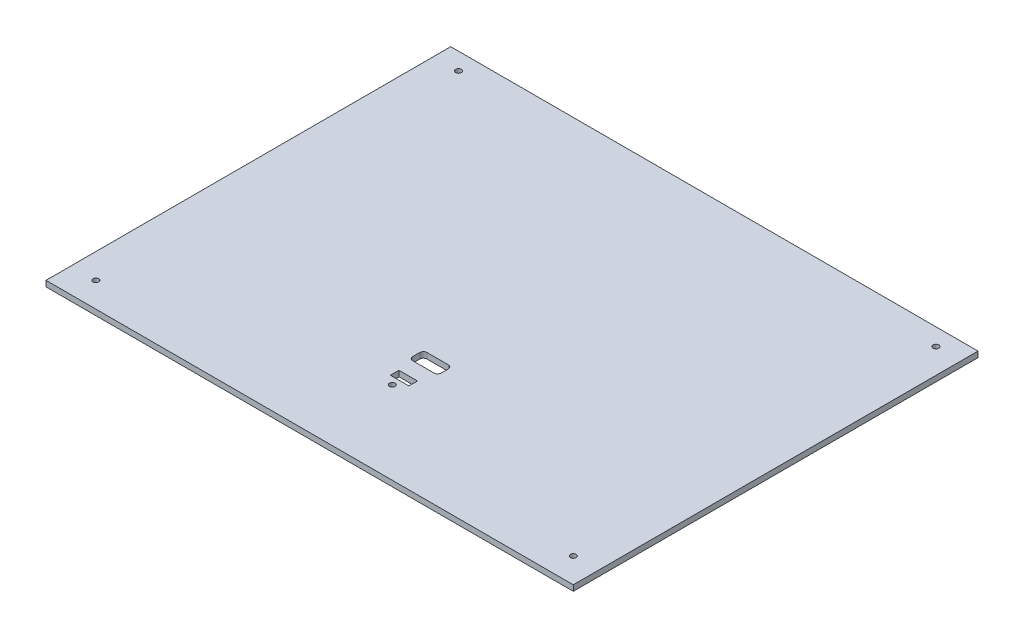
ISO-10303-21;
HEADER;
FILE_DESCRIPTION(('STEP AP214'),'2;1');
FILE_NAME('part.step','',(''),(''),'','','');
FILE_SCHEMA(('AUTOMOTIVE_DESIGN { 1 0 10303 214 1 1 1 1 }'));
ENDSEC;
DATA;
#1=APPLICATION_CONTEXT('core data for automotive mechanical design processes');
#2=APPLICATION_PROTOCOL_DEFINITION('international standard','automotive_design',2000,#1);
#3=PRODUCT_CONTEXT('',#1,'mechanical');
#4=PRODUCT('Part','Part','',(#3));
#5=PRODUCT_RELATED_PRODUCT_CATEGORY('part','',(#4));
#6=PRODUCT_DEFINITION_FORMATION('','',#4);
#7=PRODUCT_DEFINITION_CONTEXT('part definition',#1,'design');
#8=PRODUCT_DEFINITION('design','',#6,#7);
#9=PRODUCT_DEFINITION_SHAPE('','',#8);
#10=(LENGTH_UNIT() NAMED_UNIT(*) SI_UNIT(.MILLI.,.METRE.));
#11=(NAMED_UNIT(*) PLANE_ANGLE_UNIT() SI_UNIT($,.RADIAN.));
#12=(NAMED_UNIT(*) SI_UNIT($,.STERADIAN.) SOLID_ANGLE_UNIT());
#13=UNCERTAINTY_MEASURE_WITH_UNIT(LENGTH_MEASURE(1.E-05),#10,'distance_accuracy_value','');
#14=(GEOMETRIC_REPRESENTATION_CONTEXT(3) GLOBAL_UNCERTAINTY_ASSIGNED_CONTEXT((#13)) GLOBAL_UNIT_ASSIGNED_CONTEXT((#10,
#11,#12)) REPRESENTATION_CONTEXT('',''));
#15=CARTESIAN_POINT('',(0.,0.,0.));
#16=DIRECTION('',(0.,0.,1.));
#17=DIRECTION('',(1.,0.,0.));
#18=AXIS2_PLACEMENT_3D('',#15,#16,#17);
#19=CARTESIAN_POINT('',(-185.,4.,142.));
#20=DIRECTION('',(1.,0.,0.));
#21=DIRECTION('',(0.,0.,-1.));
#22=AXIS2_PLACEMENT_3D('',#19,#20,#21);
#23=PLANE('',#22);
#24=DIRECTION('',(0.,0.,1.));
#25=VECTOR('',#24,1.);
#26=CARTESIAN_POINT('',(-185.,0.,142.));
#27=LINE('',#26,#25);
#28=CARTESIAN_POINT('',(-185.,0.,-142.));
#29=VERTEX_POINT('',#28);
#30=CARTESIAN_POINT('',(-185.,0.,142.));
#31=VERTEX_POINT('',#30);
#32=EDGE_CURVE('E263',#29,#31,#27,.T.);
#33=ORIENTED_EDGE('',*,*,#32,.T.);
#34=DIRECTION('',(0.,-1.,0.));
#35=VECTOR('',#34,1.);
#36=CARTESIAN_POINT('',(-185.,4.,142.));
#37=LINE('',#36,#35);
#38=CARTESIAN_POINT('',(-185.,4.,142.));
#39=VERTEX_POINT('',#38);
#40=EDGE_CURVE('E301',#39,#31,#37,.T.);
#41=ORIENTED_EDGE('',*,*,#40,.F.);
#42=DIRECTION('',(0.,0.,1.));
#43=VECTOR('',#42,1.);
#44=CARTESIAN_POINT('',(-185.,4.,142.));
#45=LINE('',#44,#43);
#46=CARTESIAN_POINT('',(-185.,4.,-142.));
#47=VERTEX_POINT('',#46);
#48=EDGE_CURVE('E264',#47,#39,#45,.T.);
#49=ORIENTED_EDGE('',*,*,#48,.F.);
#50=DIRECTION('',(0.,-1.,0.));
#51=VECTOR('',#50,1.);
#52=CARTESIAN_POINT('',(-185.,4.,-142.));
#53=LINE('',#52,#51);
#54=EDGE_CURVE('E278',#47,#29,#53,.T.);
#55=ORIENTED_EDGE('',*,*,#54,.T.);
#56=EDGE_LOOP('',(#33,#41,#49,#55));
#57=FACE_BOUND('',#56,.T.);
#58=ADVANCED_FACE('F43',(#57),#23,.F.);
#59=CARTESIAN_POINT('',(185.,4.,142.));
#60=DIRECTION('',(0.,0.,-1.));
#61=DIRECTION('',(-1.,0.,0.));
#62=AXIS2_PLACEMENT_3D('',#59,#60,#61);
#63=PLANE('',#62);
#64=DIRECTION('',(1.,0.,0.));
#65=VECTOR('',#64,1.);
#66=CARTESIAN_POINT('',(185.,0.,142.));
#67=LINE('',#66,#65);
#68=CARTESIAN_POINT('',(185.,0.,142.));
#69=VERTEX_POINT('',#68);
#70=EDGE_CURVE('E282',#31,#69,#67,.T.);
#71=ORIENTED_EDGE('',*,*,#70,.T.);
#72=DIRECTION('',(0.,-1.,0.));
#73=VECTOR('',#72,1.);
#74=CARTESIAN_POINT('',(185.,4.,142.));
#75=LINE('',#74,#73);
#76=CARTESIAN_POINT('',(185.,4.,142.));
#77=VERTEX_POINT('',#76);
#78=EDGE_CURVE('E297',#77,#69,#75,.T.);
#79=ORIENTED_EDGE('',*,*,#78,.F.);
#80=DIRECTION('',(1.,0.,0.));
#81=VECTOR('',#80,1.);
#82=CARTESIAN_POINT('',(185.,4.,142.));
#83=LINE('',#82,#81);
#84=EDGE_CURVE('E268',#39,#77,#83,.T.);
#85=ORIENTED_EDGE('',*,*,#84,.F.);
#86=ORIENTED_EDGE('',*,*,#40,.T.);
#87=EDGE_LOOP('',(#71,#79,#85,#86));
#88=FACE_BOUND('',#87,.T.);
#89=ADVANCED_FACE('F395',(#88),#63,.F.);
#90=CARTESIAN_POINT('',(185.,4.,142.));
#91=DIRECTION('',(-1.,0.,0.));
#92=DIRECTION('',(0.,0.,1.));
#93=AXIS2_PLACEMENT_3D('',#90,#91,#92);
#94=PLANE('',#93);
#95=DIRECTION('',(0.,0.,-1.));
#96=VECTOR('',#95,1.);
#97=CARTESIAN_POINT('',(185.,0.,142.));
#98=LINE('',#97,#96);
#99=CARTESIAN_POINT('',(185.,0.,-142.));
#100=VERTEX_POINT('',#99);
#101=EDGE_CURVE('E285',#69,#100,#98,.T.);
#102=ORIENTED_EDGE('',*,*,#101,.T.);
#103=DIRECTION('',(0.,-1.,0.));
#104=VECTOR('',#103,1.);
#105=CARTESIAN_POINT('',(185.,4.,-142.));
#106=LINE('',#105,#104);
#107=CARTESIAN_POINT('',(185.,4.,-142.));
#108=VERTEX_POINT('',#107);
#109=EDGE_CURVE('E293',#108,#100,#106,.T.);
#110=ORIENTED_EDGE('',*,*,#109,.F.);
#111=DIRECTION('',(0.,0.,-1.));
#112=VECTOR('',#111,1.);
#113=CARTESIAN_POINT('',(185.,4.,142.));
#114=LINE('',#113,#112);
#115=EDGE_CURVE('E272',#77,#108,#114,.T.);
#116=ORIENTED_EDGE('',*,*,#115,.F.);
#117=ORIENTED_EDGE('',*,*,#78,.T.);
#118=EDGE_LOOP('',(#102,#110,#116,#117));
#119=FACE_BOUND('',#118,.T.);
#120=ADVANCED_FACE('F400',(#119),#94,.F.);
#121=CARTESIAN_POINT('',(185.,4.,-142.));
#122=DIRECTION('',(0.,0.,1.));
#123=DIRECTION('',(1.,0.,0.));
#124=AXIS2_PLACEMENT_3D('',#121,#122,#123);
#125=PLANE('',#124);
#126=DIRECTION('',(-1.,0.,0.));
#127=VECTOR('',#126,1.);
#128=CARTESIAN_POINT('',(185.,0.,-142.));
#129=LINE('',#128,#127);
#130=EDGE_CURVE('E269',#100,#29,#129,.T.);
#131=ORIENTED_EDGE('',*,*,#130,.T.);
#132=ORIENTED_EDGE('',*,*,#54,.F.);
#133=DIRECTION('',(-1.,0.,0.));
#134=VECTOR('',#133,1.);
#135=CARTESIAN_POINT('',(185.,4.,-142.));
#136=LINE('',#135,#134);
#137=EDGE_CURVE('E275',#108,#47,#136,.T.);
#138=ORIENTED_EDGE('',*,*,#137,.F.);
#139=ORIENTED_EDGE('',*,*,#109,.T.);
#140=EDGE_LOOP('',(#131,#132,#138,#139));
#141=FACE_BOUND('',#140,.T.);
#142=ADVANCED_FACE('F406',(#141),#125,.F.);
#143=CARTESIAN_POINT('',(0.,4.,0.));
#144=DIRECTION('',(0.,1.,0.));
#145=DIRECTION('',(0.,0.,1.));
#146=AXIS2_PLACEMENT_3D('',#143,#144,#145);
#147=PLANE('',#146);
#148=CARTESIAN_POINT('',(-167.5,4.,124.5));
#149=DIRECTION('',(0.,1.,0.));
#150=DIRECTION('',(0.,0.,-1.));
#151=AXIS2_PLACEMENT_3D('',#148,#149,#150);
#152=CIRCLE('',#151,2.);
#153=CARTESIAN_POINT('',(-167.5,4.,122.5));
#154=VERTEX_POINT('',#153);
#155=EDGE_CURVE('E226',#154,#154,#152,.T.);
#156=ORIENTED_EDGE('',*,*,#155,.F.);
#157=EDGE_LOOP('',(#156));
#158=FACE_BOUND('',#157,.T.);
#159=CARTESIAN_POINT('',(167.5,4.,124.5));
#160=DIRECTION('',(0.,1.,0.));
#161=DIRECTION('',(0.,0.,1.));
#162=AXIS2_PLACEMENT_3D('',#159,#160,#161);
#163=CIRCLE('',#162,2.);
#164=CARTESIAN_POINT('',(167.5,4.,126.5));
#165=VERTEX_POINT('',#164);
#166=EDGE_CURVE('E227',#165,#165,#163,.T.);
#167=ORIENTED_EDGE('',*,*,#166,.F.);
#168=EDGE_LOOP('',(#167));
#169=FACE_BOUND('',#168,.T.);
#170=CARTESIAN_POINT('',(167.5,4.,-130.));
#171=DIRECTION('',(0.,1.,0.));
#172=DIRECTION('',(0.,0.,-1.));
#173=AXIS2_PLACEMENT_3D('',#170,#171,#172);
#174=CIRCLE('',#173,2.);
#175=CARTESIAN_POINT('',(167.5,4.,-132.));
#176=VERTEX_POINT('',#175);
#177=EDGE_CURVE('E236',#176,#176,#174,.T.);
#178=ORIENTED_EDGE('',*,*,#177,.F.);
#179=EDGE_LOOP('',(#178));
#180=FACE_BOUND('',#179,.T.);
#181=CARTESIAN_POINT('',(0.,4.,84.));
#182=DIRECTION('',(0.,1.,0.));
#183=DIRECTION('',(0.,0.,1.));
#184=AXIS2_PLACEMENT_3D('',#181,#182,#183);
#185=CIRCLE('',#184,2.);
#186=CARTESIAN_POINT('',(0.,4.,86.));
#187=VERTEX_POINT('',#186);
#188=EDGE_CURVE('E244',#187,#187,#185,.T.);
#189=ORIENTED_EDGE('',*,*,#188,.F.);
#190=EDGE_LOOP('',(#189));
#191=FACE_BOUND('',#190,.T.);
#192=DIRECTION('',(0.,0.,1.));
#193=VECTOR('',#192,1.);
#194=CARTESIAN_POINT('',(-6.50000000000001,4.,72.85));
#195=LINE('',#194,#193);
#196=CARTESIAN_POINT('',(-6.50000000000001,4.,72.85));
#197=VERTEX_POINT('',#196);
#198=CARTESIAN_POINT('',(-6.50000000000001,4.,78.85));
#199=VERTEX_POINT('',#198);
#200=EDGE_CURVE('E252',#197,#199,#195,.T.);
#201=ORIENTED_EDGE('',*,*,#200,.F.);
#202=DIRECTION('',(-1.,0.,0.));
#203=VECTOR('',#202,1.);
#204=CARTESIAN_POINT('',(6.49999999999999,4.,72.85));
#205=LINE('',#204,#203);
#206=CARTESIAN_POINT('',(6.49999999999999,4.,72.85));
#207=VERTEX_POINT('',#206);
#208=EDGE_CURVE('E175',#207,#197,#205,.T.);
#209=ORIENTED_EDGE('',*,*,#208,.F.);
#210=DIRECTION('',(0.,0.,-1.));
#211=VECTOR('',#210,1.);
#212=CARTESIAN_POINT('',(6.49999999999999,4.,72.85));
#213=LINE('',#212,#211);
#214=CARTESIAN_POINT('',(6.49999999999999,4.,78.85));
#215=VERTEX_POINT('',#214);
#216=EDGE_CURVE('E647',#215,#207,#213,.T.);
#217=ORIENTED_EDGE('',*,*,#216,.F.);
#218=DIRECTION('',(1.,0.,0.));
#219=VECTOR('',#218,1.);
#220=CARTESIAN_POINT('',(6.49999999999999,4.,78.85));
#221=LINE('',#220,#219);
#222=EDGE_CURVE('E651',#199,#215,#221,.T.);
#223=ORIENTED_EDGE('',*,*,#222,.F.);
#224=EDGE_LOOP('',(#201,#209,#217,#223));
#225=FACE_BOUND('',#224,.T.);
#226=DIRECTION('',(0.,0.,1.));
#227=VECTOR('',#226,1.);
#228=CARTESIAN_POINT('',(-10.,4.,52.1873810908358));
#229=LINE('',#228,#227);
#230=CARTESIAN_POINT('',(-10.,4.,54.6873810908358));
#231=VERTEX_POINT('',#230);
#232=CARTESIAN_POINT('',(-10.,4.,59.6873810908358));
#233=VERTEX_POINT('',#232);
#234=EDGE_CURVE('E209',#231,#233,#229,.T.);
#235=ORIENTED_EDGE('',*,*,#234,.F.);
#236=CARTESIAN_POINT('',(-7.5,4.,54.6873810908358));
#237=DIRECTION('',(0.,1.,0.));
#238=DIRECTION('',(0.,0.,1.));
#239=AXIS2_PLACEMENT_3D('',#236,#237,#238);
#240=CIRCLE('',#239,2.5);
#241=CARTESIAN_POINT('',(-7.5,4.,52.1873810908358));
#242=VERTEX_POINT('',#241);
#243=EDGE_CURVE('E52',#231,#242,#240,.F.);
#244=ORIENTED_EDGE('',*,*,#243,.T.);
#245=DIRECTION('',(-1.,0.,0.));
#246=VECTOR('',#245,1.);
#247=CARTESIAN_POINT('',(10.,4.,52.1873810908358));
#248=LINE('',#247,#246);
#249=CARTESIAN_POINT('',(7.5,4.,52.1873810908358));
#250=VERTEX_POINT('',#249);
#251=EDGE_CURVE('E196',#250,#242,#248,.T.);
#252=ORIENTED_EDGE('',*,*,#251,.F.);
#253=CARTESIAN_POINT('',(7.5,4.,54.6873810908358));
#254=DIRECTION('',(0.,1.,0.));
#255=DIRECTION('',(0.,0.,1.));
#256=AXIS2_PLACEMENT_3D('',#253,#254,#255);
#257=CIRCLE('',#256,2.5);
#258=CARTESIAN_POINT('',(10.,4.,54.6873810908358));
#259=VERTEX_POINT('',#258);
#260=EDGE_CURVE('E332',#250,#259,#257,.F.);
#261=ORIENTED_EDGE('',*,*,#260,.T.);
#262=DIRECTION('',(0.,0.,-1.));
#263=VECTOR('',#262,1.);
#264=CARTESIAN_POINT('',(10.,4.,52.1873810908358));
#265=LINE('',#264,#263);
#266=CARTESIAN_POINT('',(10.,4.,59.6873810908358));
#267=VERTEX_POINT('',#266);
#268=EDGE_CURVE('E200',#267,#259,#265,.T.);
#269=ORIENTED_EDGE('',*,*,#268,.F.);
#270=CARTESIAN_POINT('',(7.5,4.,59.6873810908358));
#271=DIRECTION('',(0.,1.,0.));
#272=DIRECTION('',(0.,0.,1.));
#273=AXIS2_PLACEMENT_3D('',#270,#271,#272);
#274=CIRCLE('',#273,2.5);
#275=CARTESIAN_POINT('',(7.5,4.,62.1873810908358));
#276=VERTEX_POINT('',#275);
#277=EDGE_CURVE('E338',#267,#276,#274,.F.);
#278=ORIENTED_EDGE('',*,*,#277,.T.);
#279=DIRECTION('',(1.,0.,0.));
#280=VECTOR('',#279,1.);
#281=CARTESIAN_POINT('',(10.,4.,62.1873810908358));
#282=LINE('',#281,#280);
#283=CARTESIAN_POINT('',(-7.5,4.,62.1873810908358));
#284=VERTEX_POINT('',#283);
#285=EDGE_CURVE('E205',#284,#276,#282,.T.);
#286=ORIENTED_EDGE('',*,*,#285,.F.);
#287=CARTESIAN_POINT('',(-7.5,4.,59.6873810908358));
#288=DIRECTION('',(0.,1.,0.));
#289=DIRECTION('',(0.,0.,1.));
#290=AXIS2_PLACEMENT_3D('',#287,#288,#289);
#291=CIRCLE('',#290,2.5);
#292=EDGE_CURVE('E59',#284,#233,#291,.F.);
#293=ORIENTED_EDGE('',*,*,#292,.T.);
#294=EDGE_LOOP('',(#235,#244,#252,#261,#269,#278,#286,#293));
#295=FACE_BOUND('',#294,.T.);
#296=CARTESIAN_POINT('',(-167.5,4.,-130.));
#297=DIRECTION('',(0.,1.,0.));
#298=DIRECTION('',(0.,0.,1.));
#299=AXIS2_PLACEMENT_3D('',#296,#297,#298);
#300=CIRCLE('',#299,2.);
#301=CARTESIAN_POINT('',(-167.5,4.,-128.));
#302=VERTEX_POINT('',#301);
#303=EDGE_CURVE('E231',#302,#302,#300,.T.);
#304=ORIENTED_EDGE('',*,*,#303,.F.);
#305=EDGE_LOOP('',(#304));
#306=FACE_BOUND('',#305,.T.);
#307=ORIENTED_EDGE('',*,*,#48,.T.);
#308=ORIENTED_EDGE('',*,*,#84,.T.);
#309=ORIENTED_EDGE('',*,*,#115,.T.);
#310=ORIENTED_EDGE('',*,*,#137,.T.);
#311=EDGE_LOOP('',(#307,#308,#309,#310));
#312=FACE_BOUND('',#311,.T.);
#313=ADVANCED_FACE('F350',(#158,#169,#180,#191,#225,#295,#306,#312),#147,.T.);
#314=CARTESIAN_POINT('',(0.,0.,0.));
#315=DIRECTION('',(0.,1.,0.));
#316=DIRECTION('',(0.,0.,1.));
#317=AXIS2_PLACEMENT_3D('',#314,#315,#316);
#318=PLANE('',#317);
#319=CARTESIAN_POINT('',(-167.5,0.,124.5));
#320=DIRECTION('',(0.,1.,0.));
#321=DIRECTION('',(0.,0.,1.));
#322=AXIS2_PLACEMENT_3D('',#319,#320,#321);
#323=CIRCLE('',#322,2.);
#324=CARTESIAN_POINT('',(-167.5,0.,126.5));
#325=VERTEX_POINT('',#324);
#326=EDGE_CURVE('E222',#325,#325,#323,.F.);
#327=ORIENTED_EDGE('',*,*,#326,.F.);
#328=EDGE_LOOP('',(#327));
#329=FACE_BOUND('',#328,.T.);
#330=CARTESIAN_POINT('',(167.5,0.,124.5));
#331=DIRECTION('',(0.,1.,0.));
#332=DIRECTION('',(0.,0.,1.));
#333=AXIS2_PLACEMENT_3D('',#330,#331,#332);
#334=CIRCLE('',#333,2.);
#335=CARTESIAN_POINT('',(167.5,0.,126.5));
#336=VERTEX_POINT('',#335);
#337=EDGE_CURVE('E232',#336,#336,#334,.F.);
#338=ORIENTED_EDGE('',*,*,#337,.F.);
#339=EDGE_LOOP('',(#338));
#340=FACE_BOUND('',#339,.T.);
#341=CARTESIAN_POINT('',(167.5,0.,-130.));
#342=DIRECTION('',(0.,1.,0.));
#343=DIRECTION('',(0.,0.,1.));
#344=AXIS2_PLACEMENT_3D('',#341,#342,#343);
#345=CIRCLE('',#344,2.);
#346=CARTESIAN_POINT('',(167.5,0.,-128.));
#347=VERTEX_POINT('',#346);
#348=EDGE_CURVE('E240',#347,#347,#345,.F.);
#349=ORIENTED_EDGE('',*,*,#348,.F.);
#350=EDGE_LOOP('',(#349));
#351=FACE_BOUND('',#350,.T.);
#352=CARTESIAN_POINT('',(0.,0.,84.));
#353=DIRECTION('',(0.,1.,0.));
#354=DIRECTION('',(0.,0.,1.));
#355=AXIS2_PLACEMENT_3D('',#352,#353,#354);
#356=CIRCLE('',#355,2.);
#357=CARTESIAN_POINT('',(0.,0.,86.));
#358=VERTEX_POINT('',#357);
#359=EDGE_CURVE('E248',#358,#358,#356,.F.);
#360=ORIENTED_EDGE('',*,*,#359,.F.);
#361=EDGE_LOOP('',(#360));
#362=FACE_BOUND('',#361,.T.);
#363=DIRECTION('',(1.,0.,0.));
#364=VECTOR('',#363,1.);
#365=CARTESIAN_POINT('',(6.49999999999999,0.,72.85));
#366=LINE('',#365,#364);
#367=CARTESIAN_POINT('',(-6.50000000000001,0.,72.85));
#368=VERTEX_POINT('',#367);
#369=CARTESIAN_POINT('',(6.49999999999999,0.,72.85));
#370=VERTEX_POINT('',#369);
#371=EDGE_CURVE('E168',#368,#370,#366,.T.);
#372=ORIENTED_EDGE('',*,*,#371,.F.);
#373=DIRECTION('',(0.,0.,-1.));
#374=VECTOR('',#373,1.);
#375=CARTESIAN_POINT('',(-6.50000000000001,0.,72.85));
#376=LINE('',#375,#374);
#377=CARTESIAN_POINT('',(-6.50000000000001,0.,78.85));
#378=VERTEX_POINT('',#377);
#379=EDGE_CURVE('E157',#378,#368,#376,.T.);
#380=ORIENTED_EDGE('',*,*,#379,.F.);
#381=DIRECTION('',(-1.,0.,0.));
#382=VECTOR('',#381,1.);
#383=CARTESIAN_POINT('',(6.49999999999999,0.,78.85));
#384=LINE('',#383,#382);
#385=CARTESIAN_POINT('',(6.49999999999999,0.,78.85));
#386=VERTEX_POINT('',#385);
#387=EDGE_CURVE('E169',#386,#378,#384,.T.);
#388=ORIENTED_EDGE('',*,*,#387,.F.);
#389=DIRECTION('',(0.,0.,1.));
#390=VECTOR('',#389,1.);
#391=CARTESIAN_POINT('',(6.49999999999999,0.,72.85));
#392=LINE('',#391,#390);
#393=EDGE_CURVE('E179',#370,#386,#392,.T.);
#394=ORIENTED_EDGE('',*,*,#393,.F.);
#395=EDGE_LOOP('',(#372,#380,#388,#394));
#396=FACE_BOUND('',#395,.T.);
#397=DIRECTION('',(1.,0.,0.));
#398=VECTOR('',#397,1.);
#399=CARTESIAN_POINT('',(10.,0.,52.1873810908358));
#400=LINE('',#399,#398);
#401=CARTESIAN_POINT('',(-7.5,0.,52.1873810908358));
#402=VERTEX_POINT('',#401);
#403=CARTESIAN_POINT('',(7.5,0.,52.1873810908358));
#404=VERTEX_POINT('',#403);
#405=EDGE_CURVE('E215',#402,#404,#400,.T.);
#406=ORIENTED_EDGE('',*,*,#405,.F.);
#407=CARTESIAN_POINT('',(-7.5,0.,54.6873810908358));
#408=DIRECTION('',(0.,1.,0.));
#409=DIRECTION('',(0.,0.,1.));
#410=AXIS2_PLACEMENT_3D('',#407,#408,#409);
#411=CIRCLE('',#410,2.5);
#412=CARTESIAN_POINT('',(-10.,0.,54.6873810908358));
#413=VERTEX_POINT('',#412);
#414=EDGE_CURVE('E11',#402,#413,#411,.T.);
#415=ORIENTED_EDGE('',*,*,#414,.T.);
#416=DIRECTION('',(0.,0.,-1.));
#417=VECTOR('',#416,1.);
#418=CARTESIAN_POINT('',(-10.,0.,52.1873810908358));
#419=LINE('',#418,#417);
#420=CARTESIAN_POINT('',(-10.,0.,59.6873810908358));
#421=VERTEX_POINT('',#420);
#422=EDGE_CURVE('E195',#421,#413,#419,.T.);
#423=ORIENTED_EDGE('',*,*,#422,.F.);
#424=CARTESIAN_POINT('',(-7.5,0.,59.6873810908358));
#425=DIRECTION('',(0.,1.,0.));
#426=DIRECTION('',(0.,0.,1.));
#427=AXIS2_PLACEMENT_3D('',#424,#425,#426);
#428=CIRCLE('',#427,2.5);
#429=CARTESIAN_POINT('',(-7.5,0.,62.1873810908358));
#430=VERTEX_POINT('',#429);
#431=EDGE_CURVE('E346',#421,#430,#428,.T.);
#432=ORIENTED_EDGE('',*,*,#431,.T.);
#433=DIRECTION('',(-1.,0.,0.));
#434=VECTOR('',#433,1.);
#435=CARTESIAN_POINT('',(10.,0.,62.1873810908358));
#436=LINE('',#435,#434);
#437=CARTESIAN_POINT('',(7.5,0.,62.1873810908358));
#438=VERTEX_POINT('',#437);
#439=EDGE_CURVE('E191',#438,#430,#436,.T.);
#440=ORIENTED_EDGE('',*,*,#439,.F.);
#441=CARTESIAN_POINT('',(7.5,0.,59.6873810908358));
#442=DIRECTION('',(0.,1.,0.));
#443=DIRECTION('',(0.,0.,1.));
#444=AXIS2_PLACEMENT_3D('',#441,#442,#443);
#445=CIRCLE('',#444,2.5);
#446=CARTESIAN_POINT('',(10.,0.,59.6873810908358));
#447=VERTEX_POINT('',#446);
#448=EDGE_CURVE('E341',#438,#447,#445,.T.);
#449=ORIENTED_EDGE('',*,*,#448,.T.);
#450=DIRECTION('',(0.,0.,1.));
#451=VECTOR('',#450,1.);
#452=CARTESIAN_POINT('',(10.,0.,52.1873810908358));
#453=LINE('',#452,#451);
#454=CARTESIAN_POINT('',(10.,0.,54.6873810908358));
#455=VERTEX_POINT('',#454);
#456=EDGE_CURVE('E201',#455,#447,#453,.T.);
#457=ORIENTED_EDGE('',*,*,#456,.F.);
#458=CARTESIAN_POINT('',(7.5,0.,54.6873810908358));
#459=DIRECTION('',(0.,1.,0.));
#460=DIRECTION('',(0.,0.,1.));
#461=AXIS2_PLACEMENT_3D('',#458,#459,#460);
#462=CIRCLE('',#461,2.5);
#463=EDGE_CURVE('E335',#455,#404,#462,.T.);
#464=ORIENTED_EDGE('',*,*,#463,.T.);
#465=EDGE_LOOP('',(#406,#415,#423,#432,#440,#449,#457,#464));
#466=FACE_BOUND('',#465,.T.);
#467=CARTESIAN_POINT('',(-167.5,0.,-130.));
#468=DIRECTION('',(0.,1.,0.));
#469=DIRECTION('',(0.,0.,1.));
#470=AXIS2_PLACEMENT_3D('',#467,#468,#469);
#471=CIRCLE('',#470,2.);
#472=CARTESIAN_POINT('',(-167.5,0.,-128.));
#473=VERTEX_POINT('',#472);
#474=EDGE_CURVE('E259',#473,#473,#471,.F.);
#475=ORIENTED_EDGE('',*,*,#474,.F.);
#476=EDGE_LOOP('',(#475));
#477=FACE_BOUND('',#476,.T.);
#478=ORIENTED_EDGE('',*,*,#32,.F.);
#479=ORIENTED_EDGE('',*,*,#130,.F.);
#480=ORIENTED_EDGE('',*,*,#101,.F.);
#481=ORIENTED_EDGE('',*,*,#70,.F.);
#482=EDGE_LOOP('',(#478,#479,#480,#481));
#483=FACE_BOUND('',#482,.T.);
#484=ADVANCED_FACE('F182',(#329,#340,#351,#362,#396,#466,#477,#483),#318,.F.);
#485=CARTESIAN_POINT('',(-167.5,-22.3606797749979,-130.));
#486=DIRECTION('',(0.,1.,0.));
#487=DIRECTION('',(0.,0.,1.));
#488=AXIS2_PLACEMENT_3D('',#485,#486,#487);
#489=CYLINDRICAL_SURFACE('',#488,2.);
#490=ORIENTED_EDGE('',*,*,#474,.T.);
#491=EDGE_LOOP('',(#490));
#492=FACE_BOUND('',#491,.T.);
#493=ORIENTED_EDGE('',*,*,#303,.T.);
#494=EDGE_LOOP('',(#493));
#495=FACE_BOUND('',#494,.T.);
#496=ADVANCED_FACE('F413',(#492,#495),#489,.F.);
#497=CARTESIAN_POINT('',(-10.,-22.3606797749979,52.1873810908358));
#498=DIRECTION('',(-1.,0.,0.));
#499=DIRECTION('',(0.,0.,1.));
#500=AXIS2_PLACEMENT_3D('',#497,#498,#499);
#501=PLANE('',#500);
#502=ORIENTED_EDGE('',*,*,#234,.T.);
#503=DIRECTION('',(0.,1.,0.));
#504=VECTOR('',#503,1.);
#505=CARTESIAN_POINT('',(-10.,0.,59.6873810908358));
#506=LINE('',#505,#504);
#507=EDGE_CURVE('E329',#233,#421,#506,.F.);
#508=ORIENTED_EDGE('',*,*,#507,.T.);
#509=ORIENTED_EDGE('',*,*,#422,.T.);
#510=DIRECTION('',(0.,1.,0.));
#511=VECTOR('',#510,1.);
#512=CARTESIAN_POINT('',(-10.,4.,54.6873810908358));
#513=LINE('',#512,#511);
#514=EDGE_CURVE('E326',#413,#231,#513,.T.);
#515=ORIENTED_EDGE('',*,*,#514,.T.);
#516=EDGE_LOOP('',(#502,#508,#509,#515));
#517=FACE_BOUND('',#516,.T.);
#518=ADVANCED_FACE('F361',(#517),#501,.F.);
#519=CARTESIAN_POINT('',(10.,-22.3606797749979,52.1873810908358));
#520=DIRECTION('',(0.,0.,-1.));
#521=DIRECTION('',(-1.,0.,0.));
#522=AXIS2_PLACEMENT_3D('',#519,#520,#521);
#523=PLANE('',#522);
#524=ORIENTED_EDGE('',*,*,#405,.T.);
#525=DIRECTION('',(0.,1.,0.));
#526=VECTOR('',#525,1.);
#527=CARTESIAN_POINT('',(7.5,4.,52.1873810908358));
#528=LINE('',#527,#526);
#529=EDGE_CURVE('E308',#404,#250,#528,.T.);
#530=ORIENTED_EDGE('',*,*,#529,.T.);
#531=ORIENTED_EDGE('',*,*,#251,.T.);
#532=DIRECTION('',(0.,1.,0.));
#533=VECTOR('',#532,1.);
#534=CARTESIAN_POINT('',(-7.5,0.,52.1873810908358));
#535=LINE('',#534,#533);
#536=EDGE_CURVE('E305',#242,#402,#535,.F.);
#537=ORIENTED_EDGE('',*,*,#536,.T.);
#538=EDGE_LOOP('',(#524,#530,#531,#537));
#539=FACE_BOUND('',#538,.T.);
#540=ADVANCED_FACE('F353',(#539),#523,.F.);
#541=CARTESIAN_POINT('',(10.,-22.3606797749979,52.1873810908358));
#542=DIRECTION('',(1.,0.,0.));
#543=DIRECTION('',(0.,0.,-1.));
#544=AXIS2_PLACEMENT_3D('',#541,#542,#543);
#545=PLANE('',#544);
#546=ORIENTED_EDGE('',*,*,#268,.T.);
#547=DIRECTION('',(0.,1.,0.));
#548=VECTOR('',#547,1.);
#549=CARTESIAN_POINT('',(10.,0.,54.6873810908358));
#550=LINE('',#549,#548);
#551=EDGE_CURVE('E316',#259,#455,#550,.F.);
#552=ORIENTED_EDGE('',*,*,#551,.T.);
#553=ORIENTED_EDGE('',*,*,#456,.T.);
#554=DIRECTION('',(0.,1.,0.));
#555=VECTOR('',#554,1.);
#556=CARTESIAN_POINT('',(10.,4.,59.6873810908358));
#557=LINE('',#556,#555);
#558=EDGE_CURVE('E312',#447,#267,#557,.T.);
#559=ORIENTED_EDGE('',*,*,#558,.T.);
#560=EDGE_LOOP('',(#546,#552,#553,#559));
#561=FACE_BOUND('',#560,.T.);
#562=ADVANCED_FACE('F377',(#561),#545,.F.);
#563=CARTESIAN_POINT('',(10.,-22.3606797749979,62.1873810908358));
#564=DIRECTION('',(0.,0.,1.));
#565=DIRECTION('',(1.,0.,0.));
#566=AXIS2_PLACEMENT_3D('',#563,#564,#565);
#567=PLANE('',#566);
#568=ORIENTED_EDGE('',*,*,#285,.T.);
#569=DIRECTION('',(0.,1.,0.));
#570=VECTOR('',#569,1.);
#571=CARTESIAN_POINT('',(7.5,0.,62.1873810908358));
#572=LINE('',#571,#570);
#573=EDGE_CURVE('E323',#276,#438,#572,.F.);
#574=ORIENTED_EDGE('',*,*,#573,.T.);
#575=ORIENTED_EDGE('',*,*,#439,.T.);
#576=DIRECTION('',(0.,1.,0.));
#577=VECTOR('',#576,1.);
#578=CARTESIAN_POINT('',(-7.5,4.,62.1873810908358));
#579=LINE('',#578,#577);
#580=EDGE_CURVE('E319',#430,#284,#579,.T.);
#581=ORIENTED_EDGE('',*,*,#580,.T.);
#582=EDGE_LOOP('',(#568,#574,#575,#581));
#583=FACE_BOUND('',#582,.T.);
#584=ADVANCED_FACE('F369',(#583),#567,.F.);
#585=CARTESIAN_POINT('',(-6.50000000000001,-22.3606797749979,72.85));
#586=DIRECTION('',(-1.,0.,0.));
#587=DIRECTION('',(0.,0.,1.));
#588=AXIS2_PLACEMENT_3D('',#585,#586,#587);
#589=PLANE('',#588);
#590=ORIENTED_EDGE('',*,*,#379,.T.);
#591=DIRECTION('',(0.,1.,0.));
#592=VECTOR('',#591,1.);
#593=CARTESIAN_POINT('',(-6.50000000000001,-22.3606797749979,72.85));
#594=LINE('',#593,#592);
#595=EDGE_CURVE('E160',#368,#197,#594,.T.);
#596=ORIENTED_EDGE('',*,*,#595,.T.);
#597=ORIENTED_EDGE('',*,*,#200,.T.);
#598=DIRECTION('',(0.,1.,0.));
#599=VECTOR('',#598,1.);
#600=CARTESIAN_POINT('',(-6.50000000000001,-22.3606797749979,78.85));
#601=LINE('',#600,#599);
#602=EDGE_CURVE('E163',#378,#199,#601,.T.);
#603=ORIENTED_EDGE('',*,*,#602,.F.);
#604=EDGE_LOOP('',(#590,#596,#597,#603));
#605=FACE_BOUND('',#604,.T.);
#606=ADVANCED_FACE('F159',(#605),#589,.F.);
#607=CARTESIAN_POINT('',(6.49999999999999,-22.3606797749979,72.85));
#608=DIRECTION('',(0.,0.,-1.));
#609=DIRECTION('',(-1.,0.,0.));
#610=AXIS2_PLACEMENT_3D('',#607,#608,#609);
#611=PLANE('',#610);
#612=ORIENTED_EDGE('',*,*,#371,.T.);
#613=DIRECTION('',(0.,1.,0.));
#614=VECTOR('',#613,1.);
#615=CARTESIAN_POINT('',(6.49999999999999,-22.3606797749979,72.85));
#616=LINE('',#615,#614);
#617=EDGE_CURVE('E178',#370,#207,#616,.T.);
#618=ORIENTED_EDGE('',*,*,#617,.T.);
#619=ORIENTED_EDGE('',*,*,#208,.T.);
#620=ORIENTED_EDGE('',*,*,#595,.F.);
#621=EDGE_LOOP('',(#612,#618,#619,#620));
#622=FACE_BOUND('',#621,.T.);
#623=ADVANCED_FACE('F172',(#622),#611,.F.);
#624=CARTESIAN_POINT('',(6.49999999999999,-22.3606797749979,72.85));
#625=DIRECTION('',(1.,0.,0.));
#626=DIRECTION('',(0.,0.,-1.));
#627=AXIS2_PLACEMENT_3D('',#624,#625,#626);
#628=PLANE('',#627);
#629=ORIENTED_EDGE('',*,*,#393,.T.);
#630=DIRECTION('',(0.,1.,0.));
#631=VECTOR('',#630,1.);
#632=CARTESIAN_POINT('',(6.49999999999999,-22.3606797749979,78.85));
#633=LINE('',#632,#631);
#634=EDGE_CURVE('E635',#386,#215,#633,.T.);
#635=ORIENTED_EDGE('',*,*,#634,.T.);
#636=ORIENTED_EDGE('',*,*,#216,.T.);
#637=ORIENTED_EDGE('',*,*,#617,.F.);
#638=EDGE_LOOP('',(#629,#635,#636,#637));
#639=FACE_BOUND('',#638,.T.);
#640=ADVANCED_FACE('F443',(#639),#628,.F.);
#641=CARTESIAN_POINT('',(6.49999999999999,-22.3606797749979,78.85));
#642=DIRECTION('',(0.,0.,1.));
#643=DIRECTION('',(1.,0.,0.));
#644=AXIS2_PLACEMENT_3D('',#641,#642,#643);
#645=PLANE('',#644);
#646=ORIENTED_EDGE('',*,*,#387,.T.);
#647=ORIENTED_EDGE('',*,*,#602,.T.);
#648=ORIENTED_EDGE('',*,*,#222,.T.);
#649=ORIENTED_EDGE('',*,*,#634,.F.);
#650=EDGE_LOOP('',(#646,#647,#648,#649));
#651=FACE_BOUND('',#650,.T.);
#652=ADVANCED_FACE('F425',(#651),#645,.F.);
#653=CARTESIAN_POINT('',(0.,-22.3606797749979,84.));
#654=DIRECTION('',(0.,1.,0.));
#655=DIRECTION('',(0.,0.,1.));
#656=AXIS2_PLACEMENT_3D('',#653,#654,#655);
#657=CYLINDRICAL_SURFACE('',#656,2.);
#658=ORIENTED_EDGE('',*,*,#359,.T.);
#659=EDGE_LOOP('',(#658));
#660=FACE_BOUND('',#659,.T.);
#661=ORIENTED_EDGE('',*,*,#188,.T.);
#662=EDGE_LOOP('',(#661));
#663=FACE_BOUND('',#662,.T.);
#664=ADVANCED_FACE('F421',(#660,#663),#657,.F.);
#665=CARTESIAN_POINT('',(167.5,-22.3606797749979,-130.));
#666=DIRECTION('',(0.,1.,0.));
#667=DIRECTION('',(0.,0.,1.));
#668=AXIS2_PLACEMENT_3D('',#665,#666,#667);
#669=CYLINDRICAL_SURFACE('',#668,2.);
#670=ORIENTED_EDGE('',*,*,#348,.T.);
#671=EDGE_LOOP('',(#670));
#672=FACE_BOUND('',#671,.T.);
#673=ORIENTED_EDGE('',*,*,#177,.T.);
#674=EDGE_LOOP('',(#673));
#675=FACE_BOUND('',#674,.T.);
#676=ADVANCED_FACE('F424',(#672,#675),#669,.F.);
#677=CARTESIAN_POINT('',(167.5,-22.3606797749979,124.5));
#678=DIRECTION('',(0.,1.,0.));
#679=DIRECTION('',(0.,0.,1.));
#680=AXIS2_PLACEMENT_3D('',#677,#678,#679);
#681=CYLINDRICAL_SURFACE('',#680,2.);
#682=ORIENTED_EDGE('',*,*,#337,.T.);
#683=EDGE_LOOP('',(#682));
#684=FACE_BOUND('',#683,.T.);
#685=ORIENTED_EDGE('',*,*,#166,.T.);
#686=EDGE_LOOP('',(#685));
#687=FACE_BOUND('',#686,.T.);
#688=ADVANCED_FACE('F390',(#684,#687),#681,.F.);
#689=CARTESIAN_POINT('',(-167.5,-22.3606797749979,124.5));
#690=DIRECTION('',(0.,1.,0.));
#691=DIRECTION('',(0.,0.,1.));
#692=AXIS2_PLACEMENT_3D('',#689,#690,#691);
#693=CYLINDRICAL_SURFACE('',#692,2.);
#694=ORIENTED_EDGE('',*,*,#326,.T.);
#695=EDGE_LOOP('',(#694));
#696=FACE_BOUND('',#695,.T.);
#697=ORIENTED_EDGE('',*,*,#155,.T.);
#698=EDGE_LOOP('',(#697));
#699=FACE_BOUND('',#698,.T.);
#700=ADVANCED_FACE('F383',(#696,#699),#693,.F.);
#701=CARTESIAN_POINT('',(7.5,-22.3606797749979,54.6873810908358));
#702=DIRECTION('',(0.,-1.,0.));
#703=DIRECTION('',(0.,0.,-1.));
#704=AXIS2_PLACEMENT_3D('',#701,#702,#703);
#705=CYLINDRICAL_SURFACE('',#704,2.5);
#706=ORIENTED_EDGE('',*,*,#463,.F.);
#707=ORIENTED_EDGE('',*,*,#551,.F.);
#708=ORIENTED_EDGE('',*,*,#260,.F.);
#709=ORIENTED_EDGE('',*,*,#529,.F.);
#710=EDGE_LOOP('',(#706,#707,#708,#709));
#711=FACE_BOUND('',#710,.T.);
#712=ADVANCED_FACE('F381',(#711),#705,.F.);
#713=CARTESIAN_POINT('',(7.5,-22.3606797749979,59.6873810908358));
#714=DIRECTION('',(0.,-1.,0.));
#715=DIRECTION('',(0.,0.,-1.));
#716=AXIS2_PLACEMENT_3D('',#713,#714,#715);
#717=CYLINDRICAL_SURFACE('',#716,2.5);
#718=ORIENTED_EDGE('',*,*,#448,.F.);
#719=ORIENTED_EDGE('',*,*,#573,.F.);
#720=ORIENTED_EDGE('',*,*,#277,.F.);
#721=ORIENTED_EDGE('',*,*,#558,.F.);
#722=EDGE_LOOP('',(#718,#719,#720,#721));
#723=FACE_BOUND('',#722,.T.);
#724=ADVANCED_FACE('F372',(#723),#717,.F.);
#725=CARTESIAN_POINT('',(-7.5,-22.3606797749979,59.6873810908358));
#726=DIRECTION('',(0.,-1.,0.));
#727=DIRECTION('',(0.,0.,-1.));
#728=AXIS2_PLACEMENT_3D('',#725,#726,#727);
#729=CYLINDRICAL_SURFACE('',#728,2.5);
#730=ORIENTED_EDGE('',*,*,#431,.F.);
#731=ORIENTED_EDGE('',*,*,#507,.F.);
#732=ORIENTED_EDGE('',*,*,#292,.F.);
#733=ORIENTED_EDGE('',*,*,#580,.F.);
#734=EDGE_LOOP('',(#730,#731,#732,#733));
#735=FACE_BOUND('',#734,.T.);
#736=ADVANCED_FACE('F364',(#735),#729,.F.);
#737=CARTESIAN_POINT('',(-7.5,-22.3606797749979,54.6873810908358));
#738=DIRECTION('',(0.,-1.,0.));
#739=DIRECTION('',(0.,0.,-1.));
#740=AXIS2_PLACEMENT_3D('',#737,#738,#739);
#741=CYLINDRICAL_SURFACE('',#740,2.5);
#742=ORIENTED_EDGE('',*,*,#414,.F.);
#743=ORIENTED_EDGE('',*,*,#536,.F.);
#744=ORIENTED_EDGE('',*,*,#243,.F.);
#745=ORIENTED_EDGE('',*,*,#514,.F.);
#746=EDGE_LOOP('',(#742,#743,#744,#745));
#747=FACE_BOUND('',#746,.T.);
#748=ADVANCED_FACE('F45',(#747),#741,.F.);
#749=CLOSED_SHELL('',(#58,#89,#120,#142,#313,#484,#496,#518,#540,#562,#584,#606,#623,#640,#652,
#664,#676,#688,#700,#712,#724,#736,#748));
#750=MANIFOLD_SOLID_BREP('B2',#749);
#751=ADVANCED_BREP_SHAPE_REPRESENTATION('',(#18,#750),#14);
#752=SHAPE_DEFINITION_REPRESENTATION(#9,#751);
ENDSEC;
END-ISO-10303-21;
